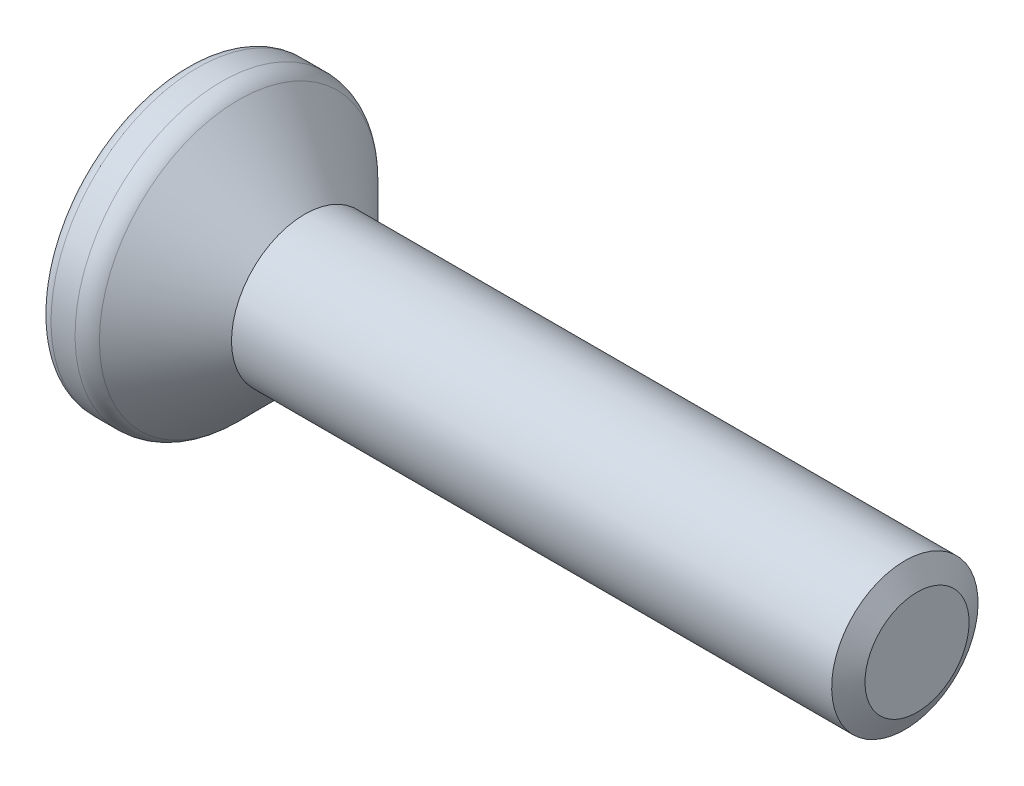
ISO-10303-21;
HEADER;
FILE_DESCRIPTION(('STEP AP214'),'2;1');
FILE_NAME('part.step','',(''),(''),'','','');
FILE_SCHEMA(('AUTOMOTIVE_DESIGN { 1 0 10303 214 1 1 1 1 }'));
ENDSEC;
DATA;
#1=APPLICATION_CONTEXT('core data for automotive mechanical design processes');
#2=APPLICATION_PROTOCOL_DEFINITION('international standard','automotive_design',2000,#1);
#3=PRODUCT_CONTEXT('',#1,'mechanical');
#4=PRODUCT('Part','Part','',(#3));
#5=PRODUCT_RELATED_PRODUCT_CATEGORY('part','',(#4));
#6=PRODUCT_DEFINITION_FORMATION('','',#4);
#7=PRODUCT_DEFINITION_CONTEXT('part definition',#1,'design');
#8=PRODUCT_DEFINITION('design','',#6,#7);
#9=PRODUCT_DEFINITION_SHAPE('','',#8);
#10=(LENGTH_UNIT() NAMED_UNIT(*) SI_UNIT(.MILLI.,.METRE.));
#11=(NAMED_UNIT(*) PLANE_ANGLE_UNIT() SI_UNIT($,.RADIAN.));
#12=(NAMED_UNIT(*) SI_UNIT($,.STERADIAN.) SOLID_ANGLE_UNIT());
#13=UNCERTAINTY_MEASURE_WITH_UNIT(LENGTH_MEASURE(1.E-05),#10,'distance_accuracy_value','');
#14=(GEOMETRIC_REPRESENTATION_CONTEXT(3) GLOBAL_UNCERTAINTY_ASSIGNED_CONTEXT((#13)) GLOBAL_UNIT_ASSIGNED_CONTEXT((#10,
#11,#12)) REPRESENTATION_CONTEXT('',''));
#15=CARTESIAN_POINT('',(0.,0.,0.));
#16=DIRECTION('',(0.,0.,1.));
#17=DIRECTION('',(1.,0.,0.));
#18=AXIS2_PLACEMENT_3D('',#15,#16,#17);
#19=CARTESIAN_POINT('',(15.,0.,0.));
#20=DIRECTION('',(1.,0.,0.));
#21=DIRECTION('',(0.,1.,0.));
#22=AXIS2_PLACEMENT_3D('',#19,#20,#21);
#23=CYLINDRICAL_SURFACE('',#22,6.);
#24=CARTESIAN_POINT('',(-13.5142135623731,0.,0.));
#25=DIRECTION('',(-1.,0.,0.));
#26=DIRECTION('',(0.,-1.,0.));
#27=AXIS2_PLACEMENT_3D('',#24,#25,#26);
#28=CIRCLE('',#27,6.);
#29=CARTESIAN_POINT('',(-13.5142135623731,-6.,0.));
#30=VERTEX_POINT('',#29);
#31=EDGE_CURVE('E157',#30,#30,#28,.T.);
#32=ORIENTED_EDGE('',*,*,#31,.T.);
#33=EDGE_LOOP('',(#32));
#34=FACE_BOUND('',#33,.T.);
#35=CARTESIAN_POINT('',(-14.5,0.,0.));
#36=DIRECTION('',(-1.,0.,0.));
#37=DIRECTION('',(0.,-1.,0.));
#38=AXIS2_PLACEMENT_3D('',#35,#36,#37);
#39=CIRCLE('',#38,6.);
#40=CARTESIAN_POINT('',(-14.5,-6.,0.));
#41=VERTEX_POINT('',#40);
#42=EDGE_CURVE('E148',#41,#41,#39,.F.);
#43=ORIENTED_EDGE('',*,*,#42,.T.);
#44=EDGE_LOOP('',(#43));
#45=FACE_BOUND('',#44,.T.);
#46=ADVANCED_FACE('F37',(#34,#45),#23,.T.);
#47=CARTESIAN_POINT('',(-10.1,0.,0.));
#48=DIRECTION('',(-1.,0.,0.));
#49=DIRECTION('',(0.,-1.,0.));
#50=AXIS2_PLACEMENT_3D('',#47,#48,#49);
#51=CONICAL_SURFACE('',#50,3.,0.785398163397443);
#52=CARTESIAN_POINT('',(-12.8071067811866,0.,0.));
#53=DIRECTION('',(1.,0.,0.));
#54=DIRECTION('',(0.,1.,0.));
#55=AXIS2_PLACEMENT_3D('',#52,#53,#54);
#56=CIRCLE('',#55,5.70710678118655);
#57=CARTESIAN_POINT('',(-12.8071067811866,5.70710678118655,0.));
#58=VERTEX_POINT('',#57);
#59=EDGE_CURVE('E154',#58,#58,#56,.T.);
#60=ORIENTED_EDGE('',*,*,#59,.T.);
#61=EDGE_LOOP('',(#60));
#62=FACE_BOUND('',#61,.T.);
#63=CARTESIAN_POINT('',(-10.1,0.,0.));
#64=DIRECTION('',(1.,0.,0.));
#65=DIRECTION('',(0.,1.,0.));
#66=AXIS2_PLACEMENT_3D('',#63,#64,#65);
#67=CIRCLE('',#66,3.);
#68=CARTESIAN_POINT('',(-10.1,3.,0.));
#69=VERTEX_POINT('',#68);
#70=EDGE_CURVE('E140',#69,#69,#67,.T.);
#71=ORIENTED_EDGE('',*,*,#70,.F.);
#72=EDGE_LOOP('',(#71));
#73=FACE_BOUND('',#72,.T.);
#74=ADVANCED_FACE('F173',(#62,#73),#51,.T.);
#75=CARTESIAN_POINT('',(15.,0.,0.));
#76=DIRECTION('',(1.,0.,0.));
#77=DIRECTION('',(0.,1.,0.));
#78=AXIS2_PLACEMENT_3D('',#75,#76,#77);
#79=CYLINDRICAL_SURFACE('',#78,3.);
#80=CARTESIAN_POINT('',(14.5,0.,0.));
#81=DIRECTION('',(1.,0.,0.));
#82=DIRECTION('',(0.,1.,0.));
#83=AXIS2_PLACEMENT_3D('',#80,#81,#82);
#84=CIRCLE('',#83,3.);
#85=CARTESIAN_POINT('',(14.5,3.,0.));
#86=VERTEX_POINT('',#85);
#87=EDGE_CURVE('E11',#86,#86,#84,.F.);
#88=ORIENTED_EDGE('',*,*,#87,.T.);
#89=EDGE_LOOP('',(#88));
#90=FACE_BOUND('',#89,.T.);
#91=ORIENTED_EDGE('',*,*,#70,.T.);
#92=EDGE_LOOP('',(#91));
#93=FACE_BOUND('',#92,.T.);
#94=ADVANCED_FACE('F179',(#90,#93),#79,.T.);
#95=CARTESIAN_POINT('',(15.,3.,0.));
#96=DIRECTION('',(1.,0.,0.));
#97=DIRECTION('',(0.,1.,0.));
#98=AXIS2_PLACEMENT_3D('',#95,#96,#97);
#99=PLANE('',#98);
#100=CARTESIAN_POINT('',(15.,0.,0.));
#101=DIRECTION('',(1.,0.,0.));
#102=DIRECTION('',(0.,1.,0.));
#103=AXIS2_PLACEMENT_3D('',#100,#101,#102);
#104=CIRCLE('',#103,2.13397459621555);
#105=CARTESIAN_POINT('',(15.,2.13397459621556,0.));
#106=VERTEX_POINT('',#105);
#107=EDGE_CURVE('E46',#106,#106,#104,.T.);
#108=ORIENTED_EDGE('',*,*,#107,.T.);
#109=EDGE_LOOP('',(#108));
#110=FACE_BOUND('',#109,.T.);
#111=ADVANCED_FACE('F162',(#110),#99,.T.);
#112=CARTESIAN_POINT('',(-15.,0.,0.));
#113=DIRECTION('',(-1.,0.,0.));
#114=DIRECTION('',(0.,-1.,0.));
#115=AXIS2_PLACEMENT_3D('',#112,#113,#114);
#116=PLANE('',#115);
#117=DIRECTION('',(0.,0.5,-0.866025403784439));
#118=VECTOR('',#117,1.);
#119=CARTESIAN_POINT('',(-15.,1.15470053837925,2.));
#120=LINE('',#119,#118);
#121=CARTESIAN_POINT('',(-15.,1.15470053837925,2.));
#122=VERTEX_POINT('',#121);
#123=CARTESIAN_POINT('',(-15.,2.3094010767585,0.));
#124=VERTEX_POINT('',#123);
#125=EDGE_CURVE('E53',#122,#124,#120,.T.);
#126=ORIENTED_EDGE('',*,*,#125,.F.);
#127=DIRECTION('',(0.,1.,0.));
#128=VECTOR('',#127,1.);
#129=CARTESIAN_POINT('',(-15.,-1.15470053837926,2.));
#130=LINE('',#129,#128);
#131=CARTESIAN_POINT('',(-15.,-1.15470053837926,2.));
#132=VERTEX_POINT('',#131);
#133=EDGE_CURVE('E136',#132,#122,#130,.T.);
#134=ORIENTED_EDGE('',*,*,#133,.F.);
#135=DIRECTION('',(0.,0.5,0.866025403784439));
#136=VECTOR('',#135,1.);
#137=CARTESIAN_POINT('',(-15.,-2.30940107675851,0.));
#138=LINE('',#137,#136);
#139=CARTESIAN_POINT('',(-15.,-2.30940107675851,0.));
#140=VERTEX_POINT('',#139);
#141=EDGE_CURVE('E134',#140,#132,#138,.T.);
#142=ORIENTED_EDGE('',*,*,#141,.F.);
#143=DIRECTION('',(0.,-0.5,0.866025403784439));
#144=VECTOR('',#143,1.);
#145=CARTESIAN_POINT('',(-15.,-1.15470053837926,-2.));
#146=LINE('',#145,#144);
#147=CARTESIAN_POINT('',(-15.,-1.15470053837926,-2.));
#148=VERTEX_POINT('',#147);
#149=EDGE_CURVE('E101',#148,#140,#146,.T.);
#150=ORIENTED_EDGE('',*,*,#149,.F.);
#151=DIRECTION('',(0.,-1.,0.));
#152=VECTOR('',#151,1.);
#153=CARTESIAN_POINT('',(-15.,1.15470053837925,-2.));
#154=LINE('',#153,#152);
#155=CARTESIAN_POINT('',(-15.,1.15470053837925,-2.));
#156=VERTEX_POINT('',#155);
#157=EDGE_CURVE('E130',#156,#148,#154,.T.);
#158=ORIENTED_EDGE('',*,*,#157,.F.);
#159=DIRECTION('',(0.,-0.5,-0.866025403784439));
#160=VECTOR('',#159,1.);
#161=CARTESIAN_POINT('',(-15.,2.3094010767585,0.));
#162=LINE('',#161,#160);
#163=EDGE_CURVE('E127',#124,#156,#162,.T.);
#164=ORIENTED_EDGE('',*,*,#163,.F.);
#165=EDGE_LOOP('',(#126,#134,#142,#150,#158,#164));
#166=FACE_BOUND('',#165,.T.);
#167=CARTESIAN_POINT('',(-15.,0.,0.));
#168=DIRECTION('',(-1.,0.,0.));
#169=DIRECTION('',(0.,-1.,0.));
#170=AXIS2_PLACEMENT_3D('',#167,#168,#169);
#171=CIRCLE('',#170,5.5);
#172=CARTESIAN_POINT('',(-15.,-5.5,0.));
#173=VERTEX_POINT('',#172);
#174=EDGE_CURVE('E151',#173,#173,#171,.T.);
#175=ORIENTED_EDGE('',*,*,#174,.T.);
#176=EDGE_LOOP('',(#175));
#177=FACE_BOUND('',#176,.T.);
#178=ADVANCED_FACE('F188',(#166,#177),#116,.T.);
#179=CARTESIAN_POINT('',(-14.5,0.,0.));
#180=DIRECTION('',(-1.,0.,0.));
#181=DIRECTION('',(0.,-1.,0.));
#182=AXIS2_PLACEMENT_3D('',#179,#180,#181);
#183=TOROIDAL_SURFACE('',#182,5.5,0.5);
#184=ORIENTED_EDGE('',*,*,#174,.F.);
#185=EDGE_LOOP('',(#184));
#186=FACE_BOUND('',#185,.T.);
#187=ORIENTED_EDGE('',*,*,#42,.F.);
#188=EDGE_LOOP('',(#187));
#189=FACE_BOUND('',#188,.T.);
#190=ADVANCED_FACE('F185',(#186,#189),#183,.T.);
#191=CARTESIAN_POINT('',(-13.5142135623731,0.,0.));
#192=DIRECTION('',(-1.,0.,0.));
#193=DIRECTION('',(0.,-1.,0.));
#194=AXIS2_PLACEMENT_3D('',#191,#192,#193);
#195=TOROIDAL_SURFACE('',#194,5.,1.);
#196=ORIENTED_EDGE('',*,*,#31,.F.);
#197=EDGE_LOOP('',(#196));
#198=FACE_BOUND('',#197,.T.);
#199=ORIENTED_EDGE('',*,*,#59,.F.);
#200=EDGE_LOOP('',(#199));
#201=FACE_BOUND('',#200,.T.);
#202=ADVANCED_FACE('F187',(#198,#201),#195,.T.);
#203=CARTESIAN_POINT('',(-12.5,1.15470053837925,2.));
#204=DIRECTION('',(0.,0.866025403784439,0.5));
#205=DIRECTION('',(0.,-0.5,0.866025403784439));
#206=AXIS2_PLACEMENT_3D('',#203,#204,#205);
#207=PLANE('',#206);
#208=ORIENTED_EDGE('',*,*,#125,.T.);
#209=DIRECTION('',(-1.,0.,0.));
#210=VECTOR('',#209,1.);
#211=CARTESIAN_POINT('',(-12.5,2.3094010767585,0.));
#212=LINE('',#211,#210);
#213=CARTESIAN_POINT('',(-12.5,2.3094010767585,0.));
#214=VERTEX_POINT('',#213);
#215=EDGE_CURVE('E83',#214,#124,#212,.T.);
#216=ORIENTED_EDGE('',*,*,#215,.F.);
#217=DIRECTION('',(0.,0.5,-0.866025403784439));
#218=VECTOR('',#217,1.);
#219=CARTESIAN_POINT('',(-12.5,1.15470053837925,2.));
#220=LINE('',#219,#218);
#221=CARTESIAN_POINT('',(-12.5,1.15470053837925,2.));
#222=VERTEX_POINT('',#221);
#223=EDGE_CURVE('E138',#222,#214,#220,.T.);
#224=ORIENTED_EDGE('',*,*,#223,.F.);
#225=DIRECTION('',(-1.,0.,0.));
#226=VECTOR('',#225,1.);
#227=CARTESIAN_POINT('',(-12.5,1.15470053837925,2.));
#228=LINE('',#227,#226);
#229=EDGE_CURVE('E61',#222,#122,#228,.T.);
#230=ORIENTED_EDGE('',*,*,#229,.T.);
#231=EDGE_LOOP('',(#208,#216,#224,#230));
#232=FACE_BOUND('',#231,.T.);
#233=ADVANCED_FACE('F191',(#232),#207,.F.);
#234=CARTESIAN_POINT('',(-12.5,-1.15470053837926,2.));
#235=DIRECTION('',(0.,0.,1.));
#236=DIRECTION('',(0.,-1.,0.));
#237=AXIS2_PLACEMENT_3D('',#234,#235,#236);
#238=PLANE('',#237);
#239=ORIENTED_EDGE('',*,*,#133,.T.);
#240=ORIENTED_EDGE('',*,*,#229,.F.);
#241=DIRECTION('',(0.,1.,0.));
#242=VECTOR('',#241,1.);
#243=CARTESIAN_POINT('',(-12.5,-1.15470053837926,2.));
#244=LINE('',#243,#242);
#245=CARTESIAN_POINT('',(-12.5,-1.15470053837926,2.));
#246=VERTEX_POINT('',#245);
#247=EDGE_CURVE('E113',#246,#222,#244,.T.);
#248=ORIENTED_EDGE('',*,*,#247,.F.);
#249=DIRECTION('',(-1.,0.,0.));
#250=VECTOR('',#249,1.);
#251=CARTESIAN_POINT('',(-12.5,-1.15470053837926,2.));
#252=LINE('',#251,#250);
#253=EDGE_CURVE('E105',#246,#132,#252,.T.);
#254=ORIENTED_EDGE('',*,*,#253,.T.);
#255=EDGE_LOOP('',(#239,#240,#248,#254));
#256=FACE_BOUND('',#255,.T.);
#257=ADVANCED_FACE('F196',(#256),#238,.F.);
#258=CARTESIAN_POINT('',(-12.5,-2.30940107675851,0.));
#259=DIRECTION('',(0.,-0.866025403784439,0.5));
#260=DIRECTION('',(0.,-0.5,-0.866025403784439));
#261=AXIS2_PLACEMENT_3D('',#258,#259,#260);
#262=PLANE('',#261);
#263=ORIENTED_EDGE('',*,*,#141,.T.);
#264=ORIENTED_EDGE('',*,*,#253,.F.);
#265=DIRECTION('',(0.,0.5,0.866025403784439));
#266=VECTOR('',#265,1.);
#267=CARTESIAN_POINT('',(-12.5,-2.30940107675851,0.));
#268=LINE('',#267,#266);
#269=CARTESIAN_POINT('',(-12.5,-2.30940107675851,0.));
#270=VERTEX_POINT('',#269);
#271=EDGE_CURVE('E109',#270,#246,#268,.T.);
#272=ORIENTED_EDGE('',*,*,#271,.F.);
#273=DIRECTION('',(-1.,0.,0.));
#274=VECTOR('',#273,1.);
#275=CARTESIAN_POINT('',(-12.5,-2.30940107675851,0.));
#276=LINE('',#275,#274);
#277=EDGE_CURVE('E94',#270,#140,#276,.T.);
#278=ORIENTED_EDGE('',*,*,#277,.T.);
#279=EDGE_LOOP('',(#263,#264,#272,#278));
#280=FACE_BOUND('',#279,.T.);
#281=ADVANCED_FACE('F110',(#280),#262,.F.);
#282=CARTESIAN_POINT('',(-12.5,-1.15470053837926,-2.));
#283=DIRECTION('',(0.,-0.866025403784439,-0.5));
#284=DIRECTION('',(0.,0.5,-0.866025403784439));
#285=AXIS2_PLACEMENT_3D('',#282,#283,#284);
#286=PLANE('',#285);
#287=ORIENTED_EDGE('',*,*,#149,.T.);
#288=ORIENTED_EDGE('',*,*,#277,.F.);
#289=DIRECTION('',(0.,-0.5,0.866025403784439));
#290=VECTOR('',#289,1.);
#291=CARTESIAN_POINT('',(-12.5,-1.15470053837926,-2.));
#292=LINE('',#291,#290);
#293=CARTESIAN_POINT('',(-12.5,-1.15470053837926,-2.));
#294=VERTEX_POINT('',#293);
#295=EDGE_CURVE('E98',#294,#270,#292,.T.);
#296=ORIENTED_EDGE('',*,*,#295,.F.);
#297=DIRECTION('',(-1.,0.,0.));
#298=VECTOR('',#297,1.);
#299=CARTESIAN_POINT('',(-12.5,-1.15470053837926,-2.));
#300=LINE('',#299,#298);
#301=EDGE_CURVE('E106',#294,#148,#300,.T.);
#302=ORIENTED_EDGE('',*,*,#301,.T.);
#303=EDGE_LOOP('',(#287,#288,#296,#302));
#304=FACE_BOUND('',#303,.T.);
#305=ADVANCED_FACE('F96',(#304),#286,.F.);
#306=CARTESIAN_POINT('',(-12.5,1.15470053837925,-2.));
#307=DIRECTION('',(0.,0.,-1.));
#308=DIRECTION('',(-1.,0.,0.));
#309=AXIS2_PLACEMENT_3D('',#306,#307,#308);
#310=PLANE('',#309);
#311=ORIENTED_EDGE('',*,*,#157,.T.);
#312=ORIENTED_EDGE('',*,*,#301,.F.);
#313=DIRECTION('',(0.,-1.,0.));
#314=VECTOR('',#313,1.);
#315=CARTESIAN_POINT('',(-12.5,1.15470053837925,-2.));
#316=LINE('',#315,#314);
#317=CARTESIAN_POINT('',(-12.5,1.15470053837925,-2.));
#318=VERTEX_POINT('',#317);
#319=EDGE_CURVE('E119',#318,#294,#316,.T.);
#320=ORIENTED_EDGE('',*,*,#319,.F.);
#321=DIRECTION('',(-1.,0.,0.));
#322=VECTOR('',#321,1.);
#323=CARTESIAN_POINT('',(-12.5,1.15470053837925,-2.));
#324=LINE('',#323,#322);
#325=EDGE_CURVE('E143',#318,#156,#324,.T.);
#326=ORIENTED_EDGE('',*,*,#325,.T.);
#327=EDGE_LOOP('',(#311,#312,#320,#326));
#328=FACE_BOUND('',#327,.T.);
#329=ADVANCED_FACE('F216',(#328),#310,.F.);
#330=CARTESIAN_POINT('',(-12.5,2.3094010767585,0.));
#331=DIRECTION('',(0.,0.866025403784439,-0.5));
#332=DIRECTION('',(0.,0.5,0.866025403784439));
#333=AXIS2_PLACEMENT_3D('',#330,#331,#332);
#334=PLANE('',#333);
#335=ORIENTED_EDGE('',*,*,#163,.T.);
#336=ORIENTED_EDGE('',*,*,#325,.F.);
#337=DIRECTION('',(0.,-0.5,-0.866025403784439));
#338=VECTOR('',#337,1.);
#339=CARTESIAN_POINT('',(-12.5,2.3094010767585,0.));
#340=LINE('',#339,#338);
#341=EDGE_CURVE('E121',#214,#318,#340,.T.);
#342=ORIENTED_EDGE('',*,*,#341,.F.);
#343=ORIENTED_EDGE('',*,*,#215,.T.);
#344=EDGE_LOOP('',(#335,#336,#342,#343));
#345=FACE_BOUND('',#344,.T.);
#346=ADVANCED_FACE('F169',(#345),#334,.F.);
#347=CARTESIAN_POINT('',(-12.5,0.,0.));
#348=DIRECTION('',(-1.,0.,0.));
#349=DIRECTION('',(0.,0.,1.));
#350=AXIS2_PLACEMENT_3D('',#347,#348,#349);
#351=PLANE('',#350);
#352=ORIENTED_EDGE('',*,*,#223,.T.);
#353=ORIENTED_EDGE('',*,*,#341,.T.);
#354=ORIENTED_EDGE('',*,*,#319,.T.);
#355=ORIENTED_EDGE('',*,*,#295,.T.);
#356=ORIENTED_EDGE('',*,*,#271,.T.);
#357=ORIENTED_EDGE('',*,*,#247,.T.);
#358=EDGE_LOOP('',(#352,#353,#354,#355,#356,#357));
#359=FACE_BOUND('',#358,.T.);
#360=ADVANCED_FACE('F116',(#359),#351,.T.);
#361=CARTESIAN_POINT('',(15.,0.,0.));
#362=DIRECTION('',(-1.,0.,0.));
#363=DIRECTION('',(0.,-1.,0.));
#364=AXIS2_PLACEMENT_3D('',#361,#362,#363);
#365=CONICAL_SURFACE('',#364,2.13397459621555,1.0471975511966);
#366=ORIENTED_EDGE('',*,*,#87,.F.);
#367=EDGE_LOOP('',(#366));
#368=FACE_BOUND('',#367,.T.);
#369=ORIENTED_EDGE('',*,*,#107,.F.);
#370=EDGE_LOOP('',(#369));
#371=FACE_BOUND('',#370,.T.);
#372=ADVANCED_FACE('F40',(#368,#371),#365,.T.);
#373=CLOSED_SHELL('',(#46,#74,#94,#111,#178,#190,#202,#233,#257,#281,#305,#329,#346,#360,#372));
#374=MANIFOLD_SOLID_BREP('B2',#373);
#375=ADVANCED_BREP_SHAPE_REPRESENTATION('',(#18,#374),#14);
#376=SHAPE_DEFINITION_REPRESENTATION(#9,#375);
ENDSEC;
END-ISO-10303-21;
